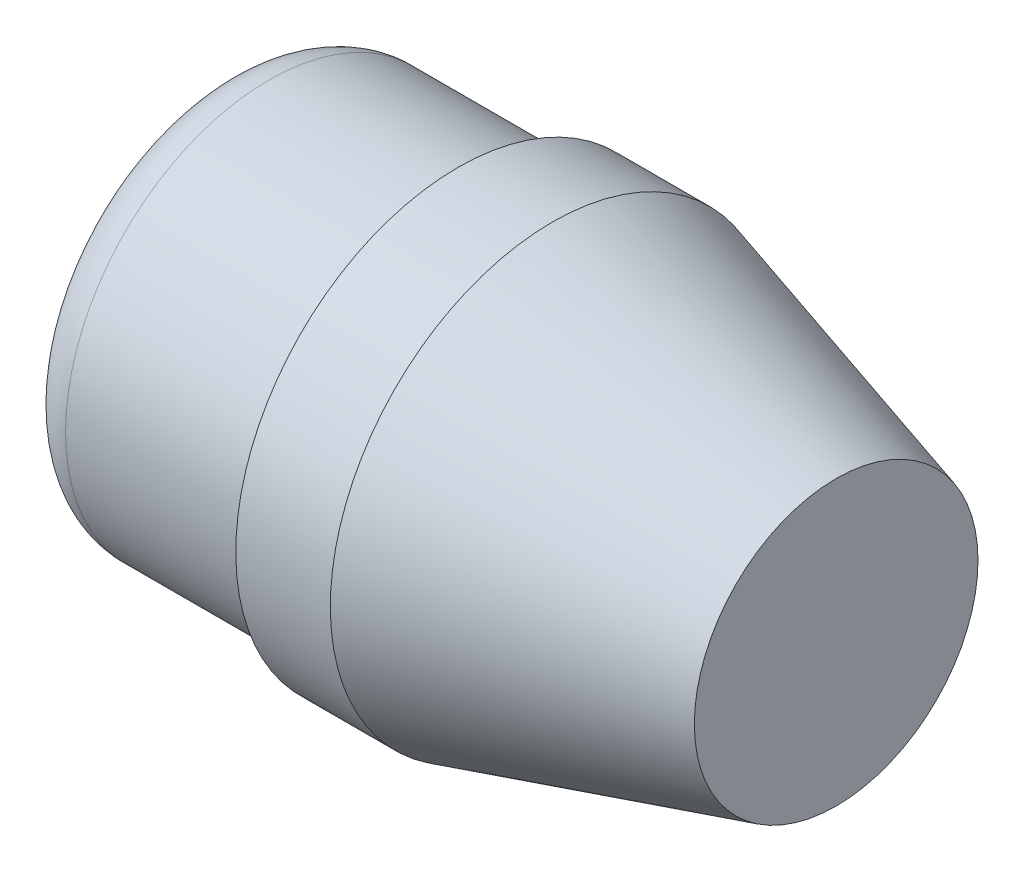
ISO-10303-21;
HEADER;
FILE_DESCRIPTION(('STEP AP214'),'2;1');
FILE_NAME('part.step','',(''),(''),'','','');
FILE_SCHEMA(('AUTOMOTIVE_DESIGN { 1 0 10303 214 1 1 1 1 }'));
ENDSEC;
DATA;
#1=APPLICATION_CONTEXT('core data for automotive mechanical design processes');
#2=APPLICATION_PROTOCOL_DEFINITION('international standard','automotive_design',2000,#1);
#3=PRODUCT_CONTEXT('',#1,'mechanical');
#4=PRODUCT('Part','Part','',(#3));
#5=PRODUCT_RELATED_PRODUCT_CATEGORY('part','',(#4));
#6=PRODUCT_DEFINITION_FORMATION('','',#4);
#7=PRODUCT_DEFINITION_CONTEXT('part definition',#1,'design');
#8=PRODUCT_DEFINITION('design','',#6,#7);
#9=PRODUCT_DEFINITION_SHAPE('','',#8);
#10=(LENGTH_UNIT() NAMED_UNIT(*) SI_UNIT(.MILLI.,.METRE.));
#11=(NAMED_UNIT(*) PLANE_ANGLE_UNIT() SI_UNIT($,.RADIAN.));
#12=(NAMED_UNIT(*) SI_UNIT($,.STERADIAN.) SOLID_ANGLE_UNIT());
#13=UNCERTAINTY_MEASURE_WITH_UNIT(LENGTH_MEASURE(1.E-05),#10,'distance_accuracy_value','');
#14=(GEOMETRIC_REPRESENTATION_CONTEXT(3) GLOBAL_UNCERTAINTY_ASSIGNED_CONTEXT((#13)) GLOBAL_UNIT_ASSIGNED_CONTEXT((#10,
#11,#12)) REPRESENTATION_CONTEXT('',''));
#15=CARTESIAN_POINT('',(0.,0.,0.));
#16=DIRECTION('',(0.,0.,1.));
#17=DIRECTION('',(1.,0.,0.));
#18=AXIS2_PLACEMENT_3D('',#15,#16,#17);
#19=CARTESIAN_POINT('',(0.,0.,0.));
#20=DIRECTION('',(-1.,0.,0.));
#21=DIRECTION('',(0.,-1.,0.));
#22=AXIS2_PLACEMENT_3D('',#19,#20,#21);
#23=PLANE('',#22);
#24=CARTESIAN_POINT('',(0.,0.,0.));
#25=DIRECTION('',(-1.,0.,0.));
#26=DIRECTION('',(0.,-1.,0.));
#27=AXIS2_PLACEMENT_3D('',#24,#25,#26);
#28=CIRCLE('',#27,3.3);
#29=CARTESIAN_POINT('',(0.,-3.3,0.));
#30=VERTEX_POINT('',#29);
#31=EDGE_CURVE('E10',#30,#30,#28,.T.);
#32=ORIENTED_EDGE('',*,*,#31,.T.);
#33=EDGE_LOOP('',(#32));
#34=FACE_BOUND('',#33,.T.);
#35=ADVANCED_FACE('F34',(#34),#23,.T.);
#36=CARTESIAN_POINT('',(13.,0.,0.));
#37=DIRECTION('',(1.,0.,0.));
#38=DIRECTION('',(0.,1.,0.));
#39=AXIS2_PLACEMENT_3D('',#36,#37,#38);
#40=CYLINDRICAL_SURFACE('',#39,4.3);
#41=CARTESIAN_POINT('',(0.999999999999999,0.,0.));
#42=DIRECTION('',(-1.,0.,0.));
#43=DIRECTION('',(0.,-1.,0.));
#44=AXIS2_PLACEMENT_3D('',#41,#42,#43);
#45=CIRCLE('',#44,4.3);
#46=CARTESIAN_POINT('',(0.999999999999999,-4.3,0.));
#47=VERTEX_POINT('',#46);
#48=EDGE_CURVE('E41',#47,#47,#45,.F.);
#49=ORIENTED_EDGE('',*,*,#48,.T.);
#50=EDGE_LOOP('',(#49));
#51=FACE_BOUND('',#50,.T.);
#52=CARTESIAN_POINT('',(5.,0.,0.));
#53=DIRECTION('',(1.,0.,0.));
#54=DIRECTION('',(0.,1.,0.));
#55=AXIS2_PLACEMENT_3D('',#52,#53,#54);
#56=CIRCLE('',#55,4.3);
#57=CARTESIAN_POINT('',(5.,4.3,0.));
#58=VERTEX_POINT('',#57);
#59=EDGE_CURVE('E45',#58,#58,#56,.T.);
#60=ORIENTED_EDGE('',*,*,#59,.F.);
#61=EDGE_LOOP('',(#60));
#62=FACE_BOUND('',#61,.T.);
#63=ADVANCED_FACE('F77',(#51,#62),#40,.T.);
#64=CARTESIAN_POINT('',(5.,4.3,0.));
#65=DIRECTION('',(-1.,0.,0.));
#66=DIRECTION('',(0.,-1.,0.));
#67=AXIS2_PLACEMENT_3D('',#64,#65,#66);
#68=PLANE('',#67);
#69=ORIENTED_EDGE('',*,*,#59,.T.);
#70=EDGE_LOOP('',(#69));
#71=FACE_BOUND('',#70,.T.);
#72=CARTESIAN_POINT('',(5.,0.,0.));
#73=DIRECTION('',(1.,0.,0.));
#74=DIRECTION('',(0.,1.,0.));
#75=AXIS2_PLACEMENT_3D('',#72,#73,#74);
#76=CIRCLE('',#75,4.7);
#77=CARTESIAN_POINT('',(5.,4.7,0.));
#78=VERTEX_POINT('',#77);
#79=EDGE_CURVE('E49',#78,#78,#76,.T.);
#80=ORIENTED_EDGE('',*,*,#79,.F.);
#81=EDGE_LOOP('',(#80));
#82=FACE_BOUND('',#81,.T.);
#83=ADVANCED_FACE('F73',(#71,#82),#68,.T.);
#84=CARTESIAN_POINT('',(13.,0.,0.));
#85=DIRECTION('',(1.,0.,0.));
#86=DIRECTION('',(0.,1.,0.));
#87=AXIS2_PLACEMENT_3D('',#84,#85,#86);
#88=CYLINDRICAL_SURFACE('',#87,4.7);
#89=ORIENTED_EDGE('',*,*,#79,.T.);
#90=EDGE_LOOP('',(#89));
#91=FACE_BOUND('',#90,.T.);
#92=CARTESIAN_POINT('',(7.,0.,0.));
#93=DIRECTION('',(1.,0.,0.));
#94=DIRECTION('',(0.,1.,0.));
#95=AXIS2_PLACEMENT_3D('',#92,#93,#94);
#96=CIRCLE('',#95,4.7);
#97=CARTESIAN_POINT('',(7.,4.7,0.));
#98=VERTEX_POINT('',#97);
#99=EDGE_CURVE('E54',#98,#98,#96,.T.);
#100=ORIENTED_EDGE('',*,*,#99,.F.);
#101=EDGE_LOOP('',(#100));
#102=FACE_BOUND('',#101,.T.);
#103=ADVANCED_FACE('F65',(#91,#102),#88,.T.);
#104=CARTESIAN_POINT('',(13.,0.,0.));
#105=DIRECTION('',(-1.,0.,0.));
#106=DIRECTION('',(0.,-1.,0.));
#107=AXIS2_PLACEMENT_3D('',#104,#105,#106);
#108=CONICAL_SURFACE('',#107,3.,0.276097019395437);
#109=ORIENTED_EDGE('',*,*,#99,.T.);
#110=EDGE_LOOP('',(#109));
#111=FACE_BOUND('',#110,.T.);
#112=CARTESIAN_POINT('',(13.,0.,0.));
#113=DIRECTION('',(1.,0.,0.));
#114=DIRECTION('',(0.,1.,0.));
#115=AXIS2_PLACEMENT_3D('',#112,#113,#114);
#116=CIRCLE('',#115,3.);
#117=CARTESIAN_POINT('',(13.,3.,0.));
#118=VERTEX_POINT('',#117);
#119=EDGE_CURVE('E57',#118,#118,#116,.T.);
#120=ORIENTED_EDGE('',*,*,#119,.F.);
#121=EDGE_LOOP('',(#120));
#122=FACE_BOUND('',#121,.T.);
#123=ADVANCED_FACE('F63',(#111,#122),#108,.T.);
#124=CARTESIAN_POINT('',(13.,3.,0.));
#125=DIRECTION('',(1.,0.,0.));
#126=DIRECTION('',(0.,1.,0.));
#127=AXIS2_PLACEMENT_3D('',#124,#125,#126);
#128=PLANE('',#127);
#129=ORIENTED_EDGE('',*,*,#119,.T.);
#130=EDGE_LOOP('',(#129));
#131=FACE_BOUND('',#130,.T.);
#132=ADVANCED_FACE('F61',(#131),#128,.T.);
#133=CARTESIAN_POINT('',(0.999999999999999,0.,0.));
#134=DIRECTION('',(-1.,0.,0.));
#135=DIRECTION('',(0.,-1.,0.));
#136=AXIS2_PLACEMENT_3D('',#133,#134,#135);
#137=TOROIDAL_SURFACE('',#136,3.3,1.);
#138=ORIENTED_EDGE('',*,*,#31,.F.);
#139=EDGE_LOOP('',(#138));
#140=FACE_BOUND('',#139,.T.);
#141=ORIENTED_EDGE('',*,*,#48,.F.);
#142=EDGE_LOOP('',(#141));
#143=FACE_BOUND('',#142,.T.);
#144=ADVANCED_FACE('F36',(#140,#143),#137,.T.);
#145=CLOSED_SHELL('',(#35,#63,#83,#103,#123,#132,#144));
#146=MANIFOLD_SOLID_BREP('B2',#145);
#147=ADVANCED_BREP_SHAPE_REPRESENTATION('',(#18,#146),#14);
#148=SHAPE_DEFINITION_REPRESENTATION(#9,#147);
ENDSEC;
END-ISO-10303-21;
